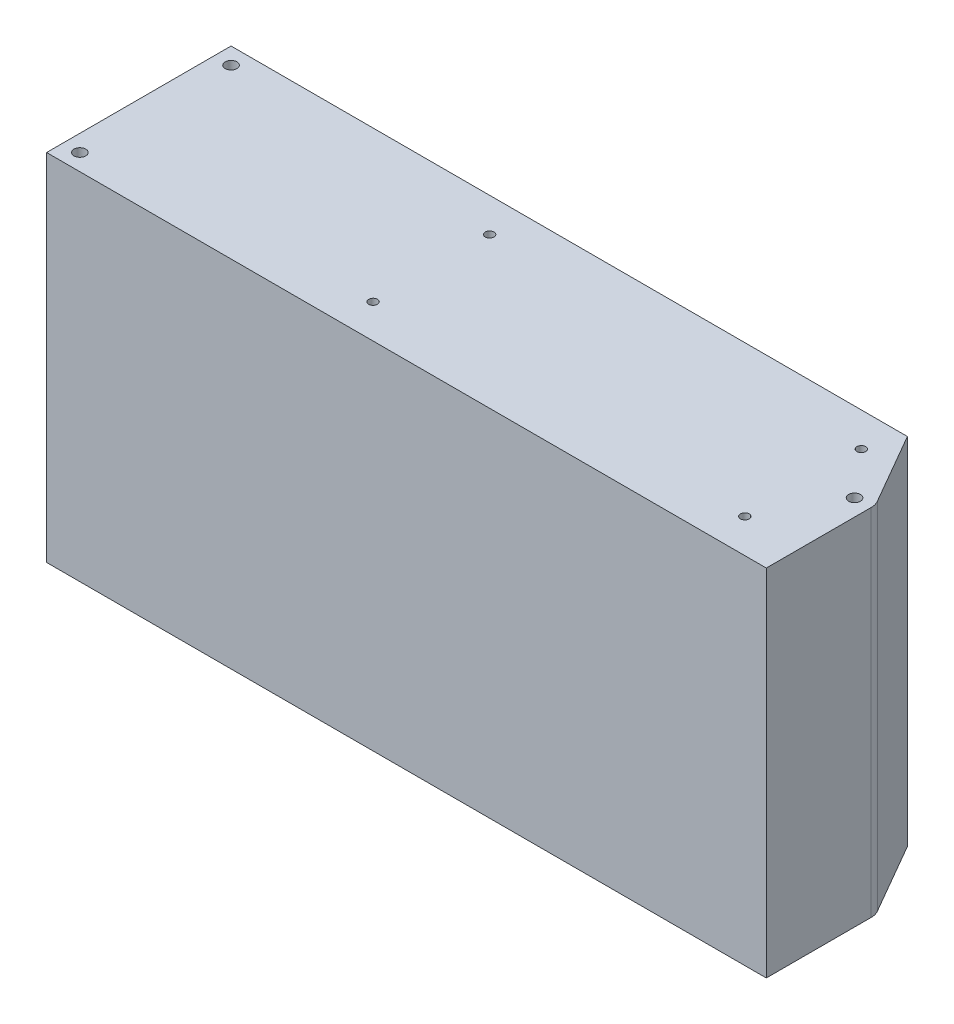
ISO-10303-21;
HEADER;
FILE_DESCRIPTION(('STEP AP214'),'2;1');
FILE_NAME('part.step','',(''),(''),'','','');
FILE_SCHEMA(('AUTOMOTIVE_DESIGN { 1 0 10303 214 1 1 1 1 }'));
ENDSEC;
DATA;
#1=APPLICATION_CONTEXT('core data for automotive mechanical design processes');
#2=APPLICATION_PROTOCOL_DEFINITION('international standard','automotive_design',2000,#1);
#3=PRODUCT_CONTEXT('',#1,'mechanical');
#4=PRODUCT('Part','Part','',(#3));
#5=PRODUCT_RELATED_PRODUCT_CATEGORY('part','',(#4));
#6=PRODUCT_DEFINITION_FORMATION('','',#4);
#7=PRODUCT_DEFINITION_CONTEXT('part definition',#1,'design');
#8=PRODUCT_DEFINITION('design','',#6,#7);
#9=PRODUCT_DEFINITION_SHAPE('','',#8);
#10=(LENGTH_UNIT() NAMED_UNIT(*) SI_UNIT(.MILLI.,.METRE.));
#11=(NAMED_UNIT(*) PLANE_ANGLE_UNIT() SI_UNIT($,.RADIAN.));
#12=(NAMED_UNIT(*) SI_UNIT($,.STERADIAN.) SOLID_ANGLE_UNIT());
#13=UNCERTAINTY_MEASURE_WITH_UNIT(LENGTH_MEASURE(1.E-05),#10,'distance_accuracy_value','');
#14=(GEOMETRIC_REPRESENTATION_CONTEXT(3) GLOBAL_UNCERTAINTY_ASSIGNED_CONTEXT((#13)) GLOBAL_UNIT_ASSIGNED_CONTEXT((#10,
#11,#12)) REPRESENTATION_CONTEXT('',''));
#15=CARTESIAN_POINT('',(0.,0.,0.));
#16=DIRECTION('',(0.,0.,1.));
#17=DIRECTION('',(1.,0.,0.));
#18=AXIS2_PLACEMENT_3D('',#15,#16,#17);
#19=CARTESIAN_POINT('',(196.423559194847,203.2,-7.25298165137614));
#20=DIRECTION('',(0.,1.,0.));
#21=DIRECTION('',(0.,0.,1.));
#22=AXIS2_PLACEMENT_3D('',#19,#20,#21);
#23=PLANE('',#22);
#24=CARTESIAN_POINT('',(-38.5264408051527,203.2,33.3375));
#25=DIRECTION('',(0.,1.,0.));
#26=DIRECTION('',(0.,0.,-1.));
#27=AXIS2_PLACEMENT_3D('',#24,#25,#26);
#28=CIRCLE('',#27,2.5);
#29=CARTESIAN_POINT('',(-38.5264408051527,203.2,30.8375));
#30=VERTEX_POINT('',#29);
#31=EDGE_CURVE('E224',#30,#30,#28,.T.);
#32=ORIENTED_EDGE('',*,*,#31,.F.);
#33=EDGE_LOOP('',(#32));
#34=FACE_BOUND('',#33,.T.);
#35=CARTESIAN_POINT('',(-38.5264408051527,203.2,-33.3375));
#36=DIRECTION('',(0.,1.,0.));
#37=DIRECTION('',(0.,0.,1.));
#38=AXIS2_PLACEMENT_3D('',#35,#36,#37);
#39=CIRCLE('',#38,2.5);
#40=CARTESIAN_POINT('',(-38.5264408051527,203.2,-30.8375));
#41=VERTEX_POINT('',#40);
#42=EDGE_CURVE('E240',#41,#41,#39,.T.);
#43=ORIENTED_EDGE('',*,*,#42,.F.);
#44=EDGE_LOOP('',(#43));
#45=FACE_BOUND('',#44,.T.);
#46=CARTESIAN_POINT('',(-196.423559194847,203.2,43.259375));
#47=DIRECTION('',(0.,1.,0.));
#48=DIRECTION('',(0.,0.,1.));
#49=AXIS2_PLACEMENT_3D('',#46,#47,#48);
#50=CIRCLE('',#49,3.37819999999999);
#51=CARTESIAN_POINT('',(-196.423559194847,203.2,46.637575));
#52=VERTEX_POINT('',#51);
#53=EDGE_CURVE('E256',#52,#52,#50,.T.);
#54=ORIENTED_EDGE('',*,*,#53,.F.);
#55=EDGE_LOOP('',(#54));
#56=FACE_BOUND('',#55,.T.);
#57=DIRECTION('',(0.,0.,1.));
#58=VECTOR('',#57,1.);
#59=CARTESIAN_POINT('',(-205.948559194847,203.2,52.784375));
#60=LINE('',#59,#58);
#61=CARTESIAN_POINT('',(-205.948559194847,203.2,-52.784375));
#62=VERTEX_POINT('',#61);
#63=CARTESIAN_POINT('',(-205.948559194847,203.2,52.784375));
#64=VERTEX_POINT('',#63);
#65=EDGE_CURVE('E146',#62,#64,#60,.T.);
#66=ORIENTED_EDGE('',*,*,#65,.T.);
#67=DIRECTION('',(1.,0.,0.));
#68=VECTOR('',#67,1.);
#69=CARTESIAN_POINT('',(-205.948559194847,203.2,52.784375));
#70=LINE('',#69,#68);
#71=CARTESIAN_POINT('',(205.948559194847,203.2,52.784375));
#72=VERTEX_POINT('',#71);
#73=EDGE_CURVE('E94',#64,#72,#70,.T.);
#74=ORIENTED_EDGE('',*,*,#73,.T.);
#75=DIRECTION('',(0.,0.,-1.));
#76=VECTOR('',#75,1.);
#77=CARTESIAN_POINT('',(205.948559194847,203.2,52.784375));
#78=LINE('',#77,#76);
#79=CARTESIAN_POINT('',(205.948559194847,203.2,-7.25298165137614));
#80=VERTEX_POINT('',#79);
#81=EDGE_CURVE('E107',#72,#80,#78,.T.);
#82=ORIENTED_EDGE('',*,*,#81,.T.);
#83=CARTESIAN_POINT('',(196.423559194847,203.2,-7.25298165137614));
#84=DIRECTION('',(0.,1.,0.));
#85=DIRECTION('',(0.,0.,1.));
#86=AXIS2_PLACEMENT_3D('',#83,#84,#85);
#87=CIRCLE('',#86,9.52499999999992);
#88=CARTESIAN_POINT('',(204.672451165894,203.2,-12.0154816513761));
#89=VERTEX_POINT('',#88);
#90=EDGE_CURVE('E101',#80,#89,#87,.T.);
#91=ORIENTED_EDGE('',*,*,#90,.T.);
#92=DIRECTION('',(-0.500000000000001,0.,-0.866025403784438));
#93=VECTOR('',#92,1.);
#94=CARTESIAN_POINT('',(204.672451165894,203.2,-12.0154816513761));
#95=LINE('',#94,#93);
#96=CARTESIAN_POINT('',(181.134519616503,203.2,-52.784375));
#97=VERTEX_POINT('',#96);
#98=EDGE_CURVE('E105',#89,#97,#95,.T.);
#99=ORIENTED_EDGE('',*,*,#98,.T.);
#100=DIRECTION('',(-1.,0.,0.));
#101=VECTOR('',#100,1.);
#102=CARTESIAN_POINT('',(-205.948559194847,203.2,-52.784375));
#103=LINE('',#102,#101);
#104=EDGE_CURVE('E57',#97,#62,#103,.T.);
#105=ORIENTED_EDGE('',*,*,#104,.T.);
#106=EDGE_LOOP('',(#66,#74,#82,#91,#99,#105));
#107=FACE_BOUND('',#106,.T.);
#108=CARTESIAN_POINT('',(-196.423559194847,203.2,-43.259375));
#109=DIRECTION('',(0.,1.,0.));
#110=DIRECTION('',(0.,0.,1.));
#111=AXIS2_PLACEMENT_3D('',#108,#109,#110);
#112=CIRCLE('',#111,3.37819999999999);
#113=CARTESIAN_POINT('',(-196.423559194847,203.2,-39.881175));
#114=VERTEX_POINT('',#113);
#115=EDGE_CURVE('E134',#114,#114,#112,.T.);
#116=ORIENTED_EDGE('',*,*,#115,.F.);
#117=EDGE_LOOP('',(#116));
#118=FACE_BOUND('',#117,.T.);
#119=CARTESIAN_POINT('',(196.423559194847,203.2,-7.25298165137614));
#120=DIRECTION('',(0.,1.,0.));
#121=DIRECTION('',(0.,0.,1.));
#122=AXIS2_PLACEMENT_3D('',#119,#120,#121);
#123=CIRCLE('',#122,3.37819999999999);
#124=CARTESIAN_POINT('',(196.423559194847,203.2,-3.87478165137615));
#125=VERTEX_POINT('',#124);
#126=EDGE_CURVE('E248',#125,#125,#123,.T.);
#127=ORIENTED_EDGE('',*,*,#126,.F.);
#128=EDGE_LOOP('',(#127));
#129=FACE_BOUND('',#128,.T.);
#130=CARTESIAN_POINT('',(174.198559194847,203.2,-33.3375));
#131=DIRECTION('',(0.,1.,0.));
#132=DIRECTION('',(0.,0.,1.));
#133=AXIS2_PLACEMENT_3D('',#130,#131,#132);
#134=CIRCLE('',#133,2.5);
#135=CARTESIAN_POINT('',(174.198559194847,203.2,-30.8375));
#136=VERTEX_POINT('',#135);
#137=EDGE_CURVE('E232',#136,#136,#134,.T.);
#138=ORIENTED_EDGE('',*,*,#137,.F.);
#139=EDGE_LOOP('',(#138));
#140=FACE_BOUND('',#139,.T.);
#141=CARTESIAN_POINT('',(174.198559194847,203.2,33.3375));
#142=DIRECTION('',(0.,1.,0.));
#143=DIRECTION('',(0.,0.,-1.));
#144=AXIS2_PLACEMENT_3D('',#141,#142,#143);
#145=CIRCLE('',#144,2.5);
#146=CARTESIAN_POINT('',(174.198559194847,203.2,30.8375));
#147=VERTEX_POINT('',#146);
#148=EDGE_CURVE('E213',#147,#147,#145,.T.);
#149=ORIENTED_EDGE('',*,*,#148,.F.);
#150=EDGE_LOOP('',(#149));
#151=FACE_BOUND('',#150,.T.);
#152=ADVANCED_FACE('F39',(#34,#45,#56,#107,#118,#129,#140,#151),#23,.T.);
#153=CARTESIAN_POINT('',(196.423559194847,0.,-7.25298165137614));
#154=DIRECTION('',(0.,1.,0.));
#155=DIRECTION('',(0.,0.,1.));
#156=AXIS2_PLACEMENT_3D('',#153,#154,#155);
#157=PLANE('',#156);
#158=DIRECTION('',(0.,0.,1.));
#159=VECTOR('',#158,1.);
#160=CARTESIAN_POINT('',(-205.948559194847,0.,52.784375));
#161=LINE('',#160,#159);
#162=CARTESIAN_POINT('',(-205.948559194847,0.,-52.784375));
#163=VERTEX_POINT('',#162);
#164=CARTESIAN_POINT('',(-205.948559194847,0.,52.784375));
#165=VERTEX_POINT('',#164);
#166=EDGE_CURVE('E129',#163,#165,#161,.T.);
#167=ORIENTED_EDGE('',*,*,#166,.F.);
#168=DIRECTION('',(-1.,0.,0.));
#169=VECTOR('',#168,1.);
#170=CARTESIAN_POINT('',(-205.948559194847,0.,-52.784375));
#171=LINE('',#170,#169);
#172=CARTESIAN_POINT('',(181.134519616503,0.,-52.784375));
#173=VERTEX_POINT('',#172);
#174=EDGE_CURVE('E86',#173,#163,#171,.T.);
#175=ORIENTED_EDGE('',*,*,#174,.F.);
#176=DIRECTION('',(-0.500000000000001,0.,-0.866025403784438));
#177=VECTOR('',#176,1.);
#178=CARTESIAN_POINT('',(204.672451165894,0.,-12.0154816513761));
#179=LINE('',#178,#177);
#180=CARTESIAN_POINT('',(204.672451165894,0.,-12.0154816513761));
#181=VERTEX_POINT('',#180);
#182=EDGE_CURVE('E80',#181,#173,#179,.T.);
#183=ORIENTED_EDGE('',*,*,#182,.F.);
#184=CARTESIAN_POINT('',(196.423559194847,0.,-7.25298165137614));
#185=DIRECTION('',(0.,1.,0.));
#186=DIRECTION('',(0.,0.,1.));
#187=AXIS2_PLACEMENT_3D('',#184,#185,#186);
#188=CIRCLE('',#187,9.52499999999992);
#189=CARTESIAN_POINT('',(205.948559194847,0.,-7.25298165137614));
#190=VERTEX_POINT('',#189);
#191=EDGE_CURVE('E116',#190,#181,#188,.T.);
#192=ORIENTED_EDGE('',*,*,#191,.F.);
#193=DIRECTION('',(0.,0.,-1.));
#194=VECTOR('',#193,1.);
#195=CARTESIAN_POINT('',(205.948559194847,0.,52.784375));
#196=LINE('',#195,#194);
#197=CARTESIAN_POINT('',(205.948559194847,0.,52.784375));
#198=VERTEX_POINT('',#197);
#199=EDGE_CURVE('E137',#198,#190,#196,.T.);
#200=ORIENTED_EDGE('',*,*,#199,.F.);
#201=DIRECTION('',(1.,0.,0.));
#202=VECTOR('',#201,1.);
#203=CARTESIAN_POINT('',(-205.948559194847,0.,52.784375));
#204=LINE('',#203,#202);
#205=EDGE_CURVE('E133',#165,#198,#204,.T.);
#206=ORIENTED_EDGE('',*,*,#205,.F.);
#207=EDGE_LOOP('',(#167,#175,#183,#192,#200,#206));
#208=FACE_BOUND('',#207,.T.);
#209=CARTESIAN_POINT('',(-196.423559194847,0.,-43.259375));
#210=DIRECTION('',(0.,1.,0.));
#211=DIRECTION('',(0.,0.,1.));
#212=AXIS2_PLACEMENT_3D('',#209,#210,#211);
#213=CIRCLE('',#212,3.37819999999999);
#214=CARTESIAN_POINT('',(-196.423559194847,0.,-39.881175));
#215=VERTEX_POINT('',#214);
#216=EDGE_CURVE('E260',#215,#215,#213,.T.);
#217=ORIENTED_EDGE('',*,*,#216,.T.);
#218=EDGE_LOOP('',(#217));
#219=FACE_BOUND('',#218,.T.);
#220=CARTESIAN_POINT('',(-196.423559194847,0.,43.259375));
#221=DIRECTION('',(0.,1.,0.));
#222=DIRECTION('',(0.,0.,1.));
#223=AXIS2_PLACEMENT_3D('',#220,#221,#222);
#224=CIRCLE('',#223,3.37819999999999);
#225=CARTESIAN_POINT('',(-196.423559194847,0.,46.637575));
#226=VERTEX_POINT('',#225);
#227=EDGE_CURVE('E252',#226,#226,#224,.T.);
#228=ORIENTED_EDGE('',*,*,#227,.T.);
#229=EDGE_LOOP('',(#228));
#230=FACE_BOUND('',#229,.T.);
#231=CARTESIAN_POINT('',(196.423559194847,0.,-7.25298165137614));
#232=DIRECTION('',(0.,1.,0.));
#233=DIRECTION('',(0.,0.,1.));
#234=AXIS2_PLACEMENT_3D('',#231,#232,#233);
#235=CIRCLE('',#234,3.37819999999999);
#236=CARTESIAN_POINT('',(196.423559194847,0.,-3.87478165137615));
#237=VERTEX_POINT('',#236);
#238=EDGE_CURVE('E244',#237,#237,#235,.T.);
#239=ORIENTED_EDGE('',*,*,#238,.T.);
#240=EDGE_LOOP('',(#239));
#241=FACE_BOUND('',#240,.T.);
#242=CARTESIAN_POINT('',(-38.5264408051527,0.,-33.3375));
#243=DIRECTION('',(0.,1.,0.));
#244=DIRECTION('',(0.,0.,1.));
#245=AXIS2_PLACEMENT_3D('',#242,#243,#244);
#246=CIRCLE('',#245,2.5);
#247=CARTESIAN_POINT('',(-38.5264408051527,0.,-30.8375));
#248=VERTEX_POINT('',#247);
#249=EDGE_CURVE('E236',#248,#248,#246,.T.);
#250=ORIENTED_EDGE('',*,*,#249,.T.);
#251=EDGE_LOOP('',(#250));
#252=FACE_BOUND('',#251,.T.);
#253=CARTESIAN_POINT('',(174.198559194847,0.,-33.3375));
#254=DIRECTION('',(0.,1.,0.));
#255=DIRECTION('',(0.,0.,1.));
#256=AXIS2_PLACEMENT_3D('',#253,#254,#255);
#257=CIRCLE('',#256,2.5);
#258=CARTESIAN_POINT('',(174.198559194847,0.,-30.8375));
#259=VERTEX_POINT('',#258);
#260=EDGE_CURVE('E228',#259,#259,#257,.T.);
#261=ORIENTED_EDGE('',*,*,#260,.T.);
#262=EDGE_LOOP('',(#261));
#263=FACE_BOUND('',#262,.T.);
#264=CARTESIAN_POINT('',(-38.5264408051527,0.,33.3375));
#265=DIRECTION('',(0.,1.,0.));
#266=DIRECTION('',(0.,0.,-1.));
#267=AXIS2_PLACEMENT_3D('',#264,#265,#266);
#268=CIRCLE('',#267,2.5);
#269=CARTESIAN_POINT('',(-38.5264408051527,0.,30.8375));
#270=VERTEX_POINT('',#269);
#271=EDGE_CURVE('E221',#270,#270,#268,.T.);
#272=ORIENTED_EDGE('',*,*,#271,.T.);
#273=EDGE_LOOP('',(#272));
#274=FACE_BOUND('',#273,.T.);
#275=CARTESIAN_POINT('',(174.198559194847,0.,33.3375));
#276=DIRECTION('',(0.,1.,0.));
#277=DIRECTION('',(0.,0.,-1.));
#278=AXIS2_PLACEMENT_3D('',#275,#276,#277);
#279=CIRCLE('',#278,2.5);
#280=CARTESIAN_POINT('',(174.198559194847,0.,30.8375));
#281=VERTEX_POINT('',#280);
#282=EDGE_CURVE('E216',#281,#281,#279,.T.);
#283=ORIENTED_EDGE('',*,*,#282,.T.);
#284=EDGE_LOOP('',(#283));
#285=FACE_BOUND('',#284,.T.);
#286=ADVANCED_FACE('F159',(#208,#219,#230,#241,#252,#263,#274,#285),#157,.F.);
#287=CARTESIAN_POINT('',(-205.948559194847,203.2,52.784375));
#288=DIRECTION('',(1.,0.,0.));
#289=DIRECTION('',(0.,0.,-1.));
#290=AXIS2_PLACEMENT_3D('',#287,#288,#289);
#291=PLANE('',#290);
#292=ORIENTED_EDGE('',*,*,#166,.T.);
#293=DIRECTION('',(0.,-1.,0.));
#294=VECTOR('',#293,1.);
#295=CARTESIAN_POINT('',(-205.948559194847,203.2,52.784375));
#296=LINE('',#295,#294);
#297=EDGE_CURVE('E11',#64,#165,#296,.T.);
#298=ORIENTED_EDGE('',*,*,#297,.F.);
#299=ORIENTED_EDGE('',*,*,#65,.F.);
#300=DIRECTION('',(0.,-1.,0.));
#301=VECTOR('',#300,1.);
#302=CARTESIAN_POINT('',(-205.948559194847,203.2,-52.784375));
#303=LINE('',#302,#301);
#304=EDGE_CURVE('E125',#62,#163,#303,.T.);
#305=ORIENTED_EDGE('',*,*,#304,.T.);
#306=EDGE_LOOP('',(#292,#298,#299,#305));
#307=FACE_BOUND('',#306,.T.);
#308=ADVANCED_FACE('F41',(#307),#291,.F.);
#309=CARTESIAN_POINT('',(-205.948559194847,203.2,52.784375));
#310=DIRECTION('',(0.,0.,-1.));
#311=DIRECTION('',(-1.,0.,0.));
#312=AXIS2_PLACEMENT_3D('',#309,#310,#311);
#313=PLANE('',#312);
#314=ORIENTED_EDGE('',*,*,#205,.T.);
#315=DIRECTION('',(0.,-1.,0.));
#316=VECTOR('',#315,1.);
#317=CARTESIAN_POINT('',(205.948559194847,203.2,52.784375));
#318=LINE('',#317,#316);
#319=EDGE_CURVE('E49',#72,#198,#318,.T.);
#320=ORIENTED_EDGE('',*,*,#319,.F.);
#321=ORIENTED_EDGE('',*,*,#73,.F.);
#322=ORIENTED_EDGE('',*,*,#297,.T.);
#323=EDGE_LOOP('',(#314,#320,#321,#322));
#324=FACE_BOUND('',#323,.T.);
#325=ADVANCED_FACE('F351',(#324),#313,.F.);
#326=CARTESIAN_POINT('',(205.948559194847,203.2,52.784375));
#327=DIRECTION('',(-1.,0.,0.));
#328=DIRECTION('',(0.,0.,1.));
#329=AXIS2_PLACEMENT_3D('',#326,#327,#328);
#330=PLANE('',#329);
#331=ORIENTED_EDGE('',*,*,#199,.T.);
#332=DIRECTION('',(0.,-1.,0.));
#333=VECTOR('',#332,1.);
#334=CARTESIAN_POINT('',(205.948559194847,203.2,-7.25298165137614));
#335=LINE('',#334,#333);
#336=EDGE_CURVE('E118',#80,#190,#335,.T.);
#337=ORIENTED_EDGE('',*,*,#336,.F.);
#338=ORIENTED_EDGE('',*,*,#81,.F.);
#339=ORIENTED_EDGE('',*,*,#319,.T.);
#340=EDGE_LOOP('',(#331,#337,#338,#339));
#341=FACE_BOUND('',#340,.T.);
#342=ADVANCED_FACE('F156',(#341),#330,.F.);
#343=CARTESIAN_POINT('',(196.423559194847,203.2,-7.25298165137614));
#344=DIRECTION('',(0.,-1.,0.));
#345=DIRECTION('',(0.,0.,-1.));
#346=AXIS2_PLACEMENT_3D('',#343,#344,#345);
#347=CYLINDRICAL_SURFACE('',#346,9.52499999999992);
#348=ORIENTED_EDGE('',*,*,#191,.T.);
#349=DIRECTION('',(0.,-1.,0.));
#350=VECTOR('',#349,1.);
#351=CARTESIAN_POINT('',(204.672451165894,203.2,-12.0154816513761));
#352=LINE('',#351,#350);
#353=EDGE_CURVE('E113',#89,#181,#352,.T.);
#354=ORIENTED_EDGE('',*,*,#353,.F.);
#355=ORIENTED_EDGE('',*,*,#90,.F.);
#356=ORIENTED_EDGE('',*,*,#336,.T.);
#357=EDGE_LOOP('',(#348,#354,#355,#356));
#358=FACE_BOUND('',#357,.T.);
#359=ADVANCED_FACE('F114',(#358),#347,.T.);
#360=CARTESIAN_POINT('',(204.672451165894,203.2,-12.0154816513761));
#361=DIRECTION('',(-0.866025403784438,0.,0.500000000000001));
#362=DIRECTION('',(0.500000000000001,0.,0.866025403784438));
#363=AXIS2_PLACEMENT_3D('',#360,#361,#362);
#364=PLANE('',#363);
#365=ORIENTED_EDGE('',*,*,#182,.T.);
#366=DIRECTION('',(0.,-1.,0.));
#367=VECTOR('',#366,1.);
#368=CARTESIAN_POINT('',(181.134519616503,203.2,-52.784375));
#369=LINE('',#368,#367);
#370=EDGE_CURVE('E119',#97,#173,#369,.T.);
#371=ORIENTED_EDGE('',*,*,#370,.F.);
#372=ORIENTED_EDGE('',*,*,#98,.F.);
#373=ORIENTED_EDGE('',*,*,#353,.T.);
#374=EDGE_LOOP('',(#365,#371,#372,#373));
#375=FACE_BOUND('',#374,.T.);
#376=ADVANCED_FACE('F121',(#375),#364,.F.);
#377=CARTESIAN_POINT('',(-205.948559194847,203.2,-52.784375));
#378=DIRECTION('',(0.,0.,1.));
#379=DIRECTION('',(1.,0.,0.));
#380=AXIS2_PLACEMENT_3D('',#377,#378,#379);
#381=PLANE('',#380);
#382=ORIENTED_EDGE('',*,*,#174,.T.);
#383=ORIENTED_EDGE('',*,*,#304,.F.);
#384=ORIENTED_EDGE('',*,*,#104,.F.);
#385=ORIENTED_EDGE('',*,*,#370,.T.);
#386=EDGE_LOOP('',(#382,#383,#384,#385));
#387=FACE_BOUND('',#386,.T.);
#388=ADVANCED_FACE('F164',(#387),#381,.F.);
#389=CARTESIAN_POINT('',(-196.423559194847,203.2,-43.259375));
#390=DIRECTION('',(0.,-1.,0.));
#391=DIRECTION('',(0.,0.,-1.));
#392=AXIS2_PLACEMENT_3D('',#389,#390,#391);
#393=CYLINDRICAL_SURFACE('',#392,3.37819999999999);
#394=ORIENTED_EDGE('',*,*,#115,.T.);
#395=EDGE_LOOP('',(#394));
#396=FACE_BOUND('',#395,.T.);
#397=ORIENTED_EDGE('',*,*,#216,.F.);
#398=EDGE_LOOP('',(#397));
#399=FACE_BOUND('',#398,.T.);
#400=ADVANCED_FACE('F166',(#396,#399),#393,.F.);
#401=CARTESIAN_POINT('',(-196.423559194847,203.2,43.259375));
#402=DIRECTION('',(0.,-1.,0.));
#403=DIRECTION('',(0.,0.,-1.));
#404=AXIS2_PLACEMENT_3D('',#401,#402,#403);
#405=CYLINDRICAL_SURFACE('',#404,3.37819999999999);
#406=ORIENTED_EDGE('',*,*,#53,.T.);
#407=EDGE_LOOP('',(#406));
#408=FACE_BOUND('',#407,.T.);
#409=ORIENTED_EDGE('',*,*,#227,.F.);
#410=EDGE_LOOP('',(#409));
#411=FACE_BOUND('',#410,.T.);
#412=ADVANCED_FACE('F172',(#408,#411),#405,.F.);
#413=CARTESIAN_POINT('',(196.423559194847,203.2,-7.25298165137614));
#414=DIRECTION('',(0.,-1.,0.));
#415=DIRECTION('',(0.,0.,-1.));
#416=AXIS2_PLACEMENT_3D('',#413,#414,#415);
#417=CYLINDRICAL_SURFACE('',#416,3.37819999999999);
#418=ORIENTED_EDGE('',*,*,#126,.T.);
#419=EDGE_LOOP('',(#418));
#420=FACE_BOUND('',#419,.T.);
#421=ORIENTED_EDGE('',*,*,#238,.F.);
#422=EDGE_LOOP('',(#421));
#423=FACE_BOUND('',#422,.T.);
#424=ADVANCED_FACE('F188',(#420,#423),#417,.F.);
#425=CARTESIAN_POINT('',(-38.5264408051527,203.2,-33.3375));
#426=DIRECTION('',(0.,-1.,0.));
#427=DIRECTION('',(0.,0.,-1.));
#428=AXIS2_PLACEMENT_3D('',#425,#426,#427);
#429=CYLINDRICAL_SURFACE('',#428,2.5);
#430=ORIENTED_EDGE('',*,*,#42,.T.);
#431=EDGE_LOOP('',(#430));
#432=FACE_BOUND('',#431,.T.);
#433=ORIENTED_EDGE('',*,*,#249,.F.);
#434=EDGE_LOOP('',(#433));
#435=FACE_BOUND('',#434,.T.);
#436=ADVANCED_FACE('F192',(#432,#435),#429,.F.);
#437=CARTESIAN_POINT('',(174.198559194847,203.2,-33.3375));
#438=DIRECTION('',(0.,-1.,0.));
#439=DIRECTION('',(0.,0.,-1.));
#440=AXIS2_PLACEMENT_3D('',#437,#438,#439);
#441=CYLINDRICAL_SURFACE('',#440,2.5);
#442=ORIENTED_EDGE('',*,*,#137,.T.);
#443=EDGE_LOOP('',(#442));
#444=FACE_BOUND('',#443,.T.);
#445=ORIENTED_EDGE('',*,*,#260,.F.);
#446=EDGE_LOOP('',(#445));
#447=FACE_BOUND('',#446,.T.);
#448=ADVANCED_FACE('F196',(#444,#447),#441,.F.);
#449=CARTESIAN_POINT('',(-38.5264408051527,203.2,33.3375));
#450=DIRECTION('',(0.,-1.,0.));
#451=DIRECTION('',(0.,0.,-1.));
#452=AXIS2_PLACEMENT_3D('',#449,#450,#451);
#453=CYLINDRICAL_SURFACE('',#452,2.5);
#454=ORIENTED_EDGE('',*,*,#31,.T.);
#455=EDGE_LOOP('',(#454));
#456=FACE_BOUND('',#455,.T.);
#457=ORIENTED_EDGE('',*,*,#271,.F.);
#458=EDGE_LOOP('',(#457));
#459=FACE_BOUND('',#458,.T.);
#460=ADVANCED_FACE('F200',(#456,#459),#453,.F.);
#461=CARTESIAN_POINT('',(174.198559194847,203.2,33.3375));
#462=DIRECTION('',(0.,-1.,0.));
#463=DIRECTION('',(0.,0.,-1.));
#464=AXIS2_PLACEMENT_3D('',#461,#462,#463);
#465=CYLINDRICAL_SURFACE('',#464,2.5);
#466=ORIENTED_EDGE('',*,*,#148,.T.);
#467=EDGE_LOOP('',(#466));
#468=FACE_BOUND('',#467,.T.);
#469=ORIENTED_EDGE('',*,*,#282,.F.);
#470=EDGE_LOOP('',(#469));
#471=FACE_BOUND('',#470,.T.);
#472=ADVANCED_FACE('F204',(#468,#471),#465,.F.);
#473=CLOSED_SHELL('',(#152,#286,#308,#325,#342,#359,#376,#388,#400,#412,#424,#436,#448,#460,#472));
#474=MANIFOLD_SOLID_BREP('B2',#473);
#475=ADVANCED_BREP_SHAPE_REPRESENTATION('',(#18,#474),#14);
#476=SHAPE_DEFINITION_REPRESENTATION(#9,#475);
ENDSEC;
END-ISO-10303-21;
